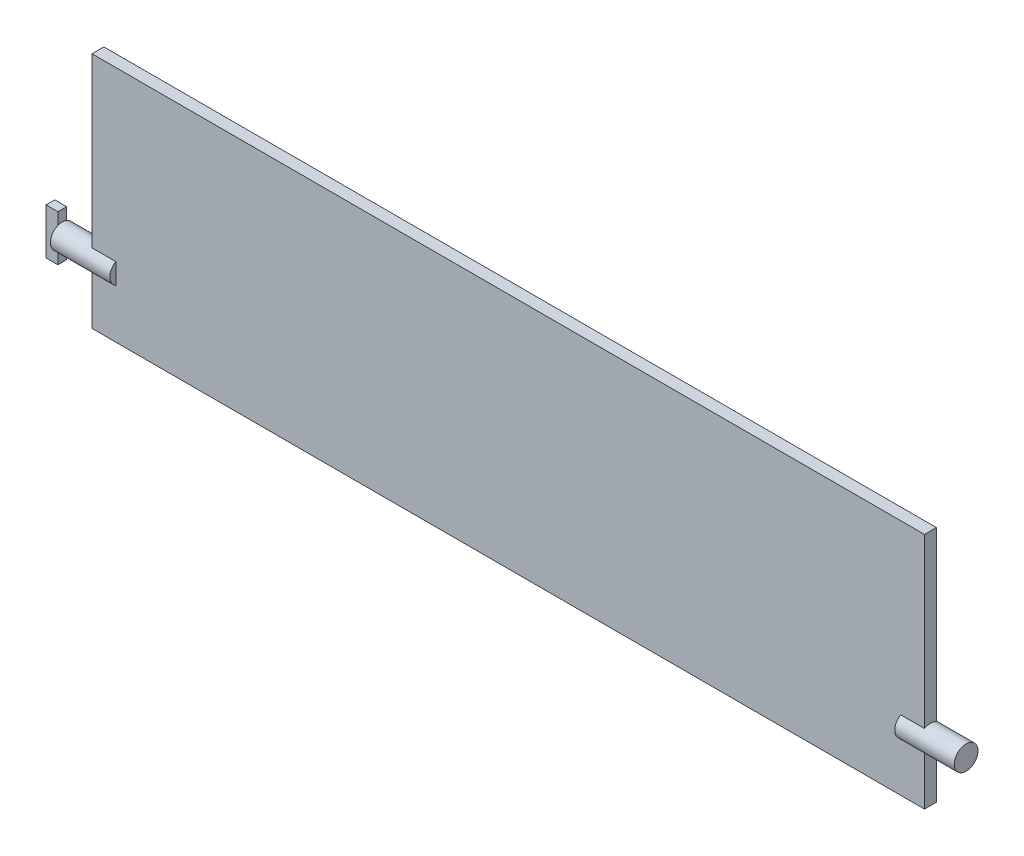
ISO-10303-21;
HEADER;
FILE_DESCRIPTION(('STEP AP214'),'2;1');
FILE_NAME('part.step','',(''),(''),'','','');
FILE_SCHEMA(('AUTOMOTIVE_DESIGN { 1 0 10303 214 1 1 1 1 }'));
ENDSEC;
DATA;
#1=APPLICATION_CONTEXT('core data for automotive mechanical design processes');
#2=APPLICATION_PROTOCOL_DEFINITION('international standard','automotive_design',2000,#1);
#3=PRODUCT_CONTEXT('',#1,'mechanical');
#4=PRODUCT('Part','Part','',(#3));
#5=PRODUCT_RELATED_PRODUCT_CATEGORY('part','',(#4));
#6=PRODUCT_DEFINITION_FORMATION('','',#4);
#7=PRODUCT_DEFINITION_CONTEXT('part definition',#1,'design');
#8=PRODUCT_DEFINITION('design','',#6,#7);
#9=PRODUCT_DEFINITION_SHAPE('','',#8);
#10=(LENGTH_UNIT() NAMED_UNIT(*) SI_UNIT(.MILLI.,.METRE.));
#11=(NAMED_UNIT(*) PLANE_ANGLE_UNIT() SI_UNIT($,.RADIAN.));
#12=(NAMED_UNIT(*) SI_UNIT($,.STERADIAN.) SOLID_ANGLE_UNIT());
#13=UNCERTAINTY_MEASURE_WITH_UNIT(LENGTH_MEASURE(1.E-05),#10,'distance_accuracy_value','');
#14=(GEOMETRIC_REPRESENTATION_CONTEXT(3) GLOBAL_UNCERTAINTY_ASSIGNED_CONTEXT((#13)) GLOBAL_UNIT_ASSIGNED_CONTEXT((#10,
#11,#12)) REPRESENTATION_CONTEXT('',''));
#15=CARTESIAN_POINT('',(0.,0.,0.));
#16=DIRECTION('',(0.,0.,1.));
#17=DIRECTION('',(1.,0.,0.));
#18=AXIS2_PLACEMENT_3D('',#15,#16,#17);
#19=CARTESIAN_POINT('',(-190.,0.,2.5));
#20=DIRECTION('',(-1.,0.,0.));
#21=DIRECTION('',(0.,0.,1.));
#22=AXIS2_PLACEMENT_3D('',#19,#20,#21);
#23=PLANE('',#22);
#24=DIRECTION('',(0.,1.,0.));
#25=VECTOR('',#24,1.);
#26=CARTESIAN_POINT('',(-190.,9.65589929881177,4.33441883065827));
#27=LINE('',#26,#25);
#28=CARTESIAN_POINT('',(-190.,-4.651333954225,4.33441883065827));
#29=VERTEX_POINT('',#28);
#30=CARTESIAN_POINT('',(-190.,4.651333954225,4.33441883065827));
#31=VERTEX_POINT('',#30);
#32=EDGE_CURVE('E11',#29,#31,#27,.T.);
#33=ORIENTED_EDGE('',*,*,#32,.F.);
#34=CARTESIAN_POINT('',(-190.,0.,2.5));
#35=DIRECTION('',(-1.,0.,0.));
#36=DIRECTION('',(0.,0.,1.));
#37=AXIS2_PLACEMENT_3D('',#34,#35,#36);
#38=CIRCLE('',#37,5.);
#39=EDGE_CURVE('E219',#29,#31,#38,.T.);
#40=ORIENTED_EDGE('',*,*,#39,.T.);
#41=EDGE_LOOP('',(#33,#40));
#42=FACE_BOUND('',#41,.T.);
#43=ADVANCED_FACE('F35',(#42),#23,.T.);
#44=CARTESIAN_POINT('',(175.,-25.,5.));
#45=DIRECTION('',(-1.,0.,0.));
#46=DIRECTION('',(0.,0.,1.));
#47=AXIS2_PLACEMENT_3D('',#44,#45,#46);
#48=PLANE('',#47);
#49=CARTESIAN_POINT('',(175.,0.,2.5));
#50=DIRECTION('',(-1.,0.,0.));
#51=DIRECTION('',(0.,0.,1.));
#52=AXIS2_PLACEMENT_3D('',#49,#50,#51);
#53=CIRCLE('',#52,5.);
#54=CARTESIAN_POINT('',(175.,-4.33012701892219,5.));
#55=VERTEX_POINT('',#54);
#56=CARTESIAN_POINT('',(175.,-4.33012701892219,0.));
#57=VERTEX_POINT('',#56);
#58=EDGE_CURVE('E212',#55,#57,#53,.F.);
#59=ORIENTED_EDGE('',*,*,#58,.F.);
#60=DIRECTION('',(0.,1.,0.));
#61=VECTOR('',#60,1.);
#62=CARTESIAN_POINT('',(175.,-25.,5.));
#63=LINE('',#62,#61);
#64=CARTESIAN_POINT('',(175.,-25.,5.));
#65=VERTEX_POINT('',#64);
#66=EDGE_CURVE('E241',#65,#55,#63,.T.);
#67=ORIENTED_EDGE('',*,*,#66,.F.);
#68=DIRECTION('',(0.,0.,-1.));
#69=VECTOR('',#68,1.);
#70=CARTESIAN_POINT('',(175.,-25.,5.));
#71=LINE('',#70,#69);
#72=CARTESIAN_POINT('',(175.,-25.,0.));
#73=VERTEX_POINT('',#72);
#74=EDGE_CURVE('E251',#65,#73,#71,.T.);
#75=ORIENTED_EDGE('',*,*,#74,.T.);
#76=DIRECTION('',(0.,1.,0.));
#77=VECTOR('',#76,1.);
#78=CARTESIAN_POINT('',(175.,-25.,0.));
#79=LINE('',#78,#77);
#80=EDGE_CURVE('E252',#73,#57,#79,.T.);
#81=ORIENTED_EDGE('',*,*,#80,.T.);
#82=EDGE_LOOP('',(#59,#67,#75,#81));
#83=FACE_BOUND('',#82,.T.);
#84=ADVANCED_FACE('F328',(#83),#48,.F.);
#85=CARTESIAN_POINT('',(0.,0.,5.));
#86=DIRECTION('',(0.,0.,-1.));
#87=DIRECTION('',(-1.,0.,0.));
#88=AXIS2_PLACEMENT_3D('',#85,#86,#87);
#89=PLANE('',#88);
#90=DIRECTION('',(1.,0.,0.));
#91=VECTOR('',#90,1.);
#92=CARTESIAN_POINT('',(165.,4.33012701892219,5.));
#93=LINE('',#92,#91);
#94=CARTESIAN_POINT('',(175.,4.33012701892219,5.));
#95=VERTEX_POINT('',#94);
#96=CARTESIAN_POINT('',(165.,4.33012701892219,5.));
#97=VERTEX_POINT('',#96);
#98=EDGE_CURVE('E217',#95,#97,#93,.F.);
#99=ORIENTED_EDGE('',*,*,#98,.F.);
#100=CARTESIAN_POINT('',(175.,75.,5.));
#101=VERTEX_POINT('',#100);
#102=EDGE_CURVE('E245',#95,#101,#63,.T.);
#103=ORIENTED_EDGE('',*,*,#102,.T.);
#104=DIRECTION('',(1.,0.,0.));
#105=VECTOR('',#104,1.);
#106=CARTESIAN_POINT('',(-175.,75.,5.));
#107=LINE('',#106,#105);
#108=CARTESIAN_POINT('',(-175.,75.,5.));
#109=VERTEX_POINT('',#108);
#110=EDGE_CURVE('E197',#109,#101,#107,.T.);
#111=ORIENTED_EDGE('',*,*,#110,.F.);
#112=DIRECTION('',(0.,-1.,0.));
#113=VECTOR('',#112,1.);
#114=CARTESIAN_POINT('',(-175.,-25.,5.));
#115=LINE('',#114,#113);
#116=CARTESIAN_POINT('',(-175.,4.33012701892219,5.));
#117=VERTEX_POINT('',#116);
#118=EDGE_CURVE('E246',#109,#117,#115,.T.);
#119=ORIENTED_EDGE('',*,*,#118,.T.);
#120=DIRECTION('',(-1.,0.,0.));
#121=VECTOR('',#120,1.);
#122=CARTESIAN_POINT('',(-165.,4.33012701892219,5.));
#123=LINE('',#122,#121);
#124=CARTESIAN_POINT('',(-165.,4.33012701892219,5.));
#125=VERTEX_POINT('',#124);
#126=EDGE_CURVE('E233',#117,#125,#123,.F.);
#127=ORIENTED_EDGE('',*,*,#126,.T.);
#128=DIRECTION('',(0.,1.,0.));
#129=VECTOR('',#128,1.);
#130=CARTESIAN_POINT('',(-165.,0.,5.));
#131=LINE('',#130,#129);
#132=CARTESIAN_POINT('',(-165.,-4.33012701892219,5.));
#133=VERTEX_POINT('',#132);
#134=EDGE_CURVE('E228',#133,#125,#131,.T.);
#135=ORIENTED_EDGE('',*,*,#134,.F.);
#136=DIRECTION('',(-1.,0.,0.));
#137=VECTOR('',#136,1.);
#138=CARTESIAN_POINT('',(-165.,-4.33012701892219,5.));
#139=LINE('',#138,#137);
#140=CARTESIAN_POINT('',(-175.,-4.33012701892219,5.));
#141=VERTEX_POINT('',#140);
#142=EDGE_CURVE('E237',#133,#141,#139,.T.);
#143=ORIENTED_EDGE('',*,*,#142,.T.);
#144=CARTESIAN_POINT('',(-175.,-25.,5.));
#145=VERTEX_POINT('',#144);
#146=EDGE_CURVE('E244',#141,#145,#115,.T.);
#147=ORIENTED_EDGE('',*,*,#146,.T.);
#148=DIRECTION('',(1.,0.,0.));
#149=VECTOR('',#148,1.);
#150=CARTESIAN_POINT('',(-175.,-25.,5.));
#151=LINE('',#150,#149);
#152=EDGE_CURVE('E249',#145,#65,#151,.T.);
#153=ORIENTED_EDGE('',*,*,#152,.T.);
#154=ORIENTED_EDGE('',*,*,#66,.T.);
#155=DIRECTION('',(1.,0.,0.));
#156=VECTOR('',#155,1.);
#157=CARTESIAN_POINT('',(165.,-4.33012701892219,5.));
#158=LINE('',#157,#156);
#159=CARTESIAN_POINT('',(165.,-4.33012701892219,5.));
#160=VERTEX_POINT('',#159);
#161=EDGE_CURVE('E214',#160,#55,#158,.T.);
#162=ORIENTED_EDGE('',*,*,#161,.F.);
#163=DIRECTION('',(0.,-1.,0.));
#164=VECTOR('',#163,1.);
#165=CARTESIAN_POINT('',(165.,0.,5.));
#166=LINE('',#165,#164);
#167=EDGE_CURVE('E210',#97,#160,#166,.T.);
#168=ORIENTED_EDGE('',*,*,#167,.F.);
#169=EDGE_LOOP('',(#99,#103,#111,#119,#127,#135,#143,#147,#153,#154,#162,#168));
#170=FACE_BOUND('',#169,.T.);
#171=ADVANCED_FACE('F334',(#170),#89,.F.);
#172=CARTESIAN_POINT('',(0.,0.,0.));
#173=DIRECTION('',(0.,0.,-1.));
#174=DIRECTION('',(-1.,0.,0.));
#175=AXIS2_PLACEMENT_3D('',#172,#173,#174);
#176=PLANE('',#175);
#177=CARTESIAN_POINT('',(175.,4.33012701892219,0.));
#178=VERTEX_POINT('',#177);
#179=CARTESIAN_POINT('',(175.,75.,0.));
#180=VERTEX_POINT('',#179);
#181=EDGE_CURVE('E240',#178,#180,#79,.T.);
#182=ORIENTED_EDGE('',*,*,#181,.F.);
#183=DIRECTION('',(1.,0.,0.));
#184=VECTOR('',#183,1.);
#185=CARTESIAN_POINT('',(165.,4.33012701892219,0.));
#186=LINE('',#185,#184);
#187=CARTESIAN_POINT('',(165.,4.33012701892219,0.));
#188=VERTEX_POINT('',#187);
#189=EDGE_CURVE('E39',#178,#188,#186,.F.);
#190=ORIENTED_EDGE('',*,*,#189,.T.);
#191=DIRECTION('',(0.,-1.,0.));
#192=VECTOR('',#191,1.);
#193=CARTESIAN_POINT('',(165.,0.,0.));
#194=LINE('',#193,#192);
#195=CARTESIAN_POINT('',(165.,-4.33012701892219,0.));
#196=VERTEX_POINT('',#195);
#197=EDGE_CURVE('E274',#188,#196,#194,.T.);
#198=ORIENTED_EDGE('',*,*,#197,.T.);
#199=DIRECTION('',(1.,0.,0.));
#200=VECTOR('',#199,1.);
#201=CARTESIAN_POINT('',(165.,-4.33012701892219,0.));
#202=LINE('',#201,#200);
#203=EDGE_CURVE('E276',#196,#57,#202,.T.);
#204=ORIENTED_EDGE('',*,*,#203,.T.);
#205=ORIENTED_EDGE('',*,*,#80,.F.);
#206=DIRECTION('',(1.,0.,0.));
#207=VECTOR('',#206,1.);
#208=CARTESIAN_POINT('',(-175.,-25.,0.));
#209=LINE('',#208,#207);
#210=CARTESIAN_POINT('',(-175.,-25.,0.));
#211=VERTEX_POINT('',#210);
#212=EDGE_CURVE('E259',#211,#73,#209,.T.);
#213=ORIENTED_EDGE('',*,*,#212,.F.);
#214=DIRECTION('',(0.,-1.,0.));
#215=VECTOR('',#214,1.);
#216=CARTESIAN_POINT('',(-175.,-25.,0.));
#217=LINE('',#216,#215);
#218=CARTESIAN_POINT('',(-175.,-4.33012701892219,0.));
#219=VERTEX_POINT('',#218);
#220=EDGE_CURVE('E255',#219,#211,#217,.T.);
#221=ORIENTED_EDGE('',*,*,#220,.F.);
#222=DIRECTION('',(-1.,0.,0.));
#223=VECTOR('',#222,1.);
#224=CARTESIAN_POINT('',(-165.,-4.33012701892219,0.));
#225=LINE('',#224,#223);
#226=CARTESIAN_POINT('',(-165.,-4.33012701892219,0.));
#227=VERTEX_POINT('',#226);
#228=EDGE_CURVE('E272',#227,#219,#225,.T.);
#229=ORIENTED_EDGE('',*,*,#228,.F.);
#230=DIRECTION('',(0.,1.,0.));
#231=VECTOR('',#230,1.);
#232=CARTESIAN_POINT('',(-165.,0.,0.));
#233=LINE('',#232,#231);
#234=CARTESIAN_POINT('',(-165.,4.33012701892219,0.));
#235=VERTEX_POINT('',#234);
#236=EDGE_CURVE('E266',#227,#235,#233,.T.);
#237=ORIENTED_EDGE('',*,*,#236,.T.);
#238=DIRECTION('',(-1.,0.,0.));
#239=VECTOR('',#238,1.);
#240=CARTESIAN_POINT('',(-165.,4.33012701892219,0.));
#241=LINE('',#240,#239);
#242=CARTESIAN_POINT('',(-175.,4.33012701892219,0.));
#243=VERTEX_POINT('',#242);
#244=EDGE_CURVE('E269',#243,#235,#241,.F.);
#245=ORIENTED_EDGE('',*,*,#244,.F.);
#246=CARTESIAN_POINT('',(-175.,75.,0.));
#247=VERTEX_POINT('',#246);
#248=EDGE_CURVE('E256',#247,#243,#217,.T.);
#249=ORIENTED_EDGE('',*,*,#248,.F.);
#250=DIRECTION('',(-1.,0.,0.));
#251=VECTOR('',#250,1.);
#252=CARTESIAN_POINT('',(175.,75.,0.));
#253=LINE('',#252,#251);
#254=EDGE_CURVE('E186',#180,#247,#253,.T.);
#255=ORIENTED_EDGE('',*,*,#254,.F.);
#256=EDGE_LOOP('',(#182,#190,#198,#204,#205,#213,#221,#229,#237,#245,#249,#255));
#257=FACE_BOUND('',#256,.T.);
#258=ADVANCED_FACE('F359',(#257),#176,.T.);
#259=CARTESIAN_POINT('',(-175.,-25.,5.));
#260=DIRECTION('',(1.,0.,0.));
#261=DIRECTION('',(0.,0.,-1.));
#262=AXIS2_PLACEMENT_3D('',#259,#260,#261);
#263=PLANE('',#262);
#264=ORIENTED_EDGE('',*,*,#248,.T.);
#265=CARTESIAN_POINT('',(-175.,0.,2.5));
#266=DIRECTION('',(1.,0.,0.));
#267=DIRECTION('',(0.,0.,-1.));
#268=AXIS2_PLACEMENT_3D('',#265,#266,#267);
#269=CIRCLE('',#268,5.);
#270=EDGE_CURVE('E230',#243,#117,#269,.T.);
#271=ORIENTED_EDGE('',*,*,#270,.T.);
#272=ORIENTED_EDGE('',*,*,#118,.F.);
#273=DIRECTION('',(0.,0.,1.));
#274=VECTOR('',#273,1.);
#275=CARTESIAN_POINT('',(-175.,75.,0.));
#276=LINE('',#275,#274);
#277=EDGE_CURVE('E189',#247,#109,#276,.T.);
#278=ORIENTED_EDGE('',*,*,#277,.F.);
#279=EDGE_LOOP('',(#264,#271,#272,#278));
#280=FACE_BOUND('',#279,.T.);
#281=ADVANCED_FACE('F363',(#280),#263,.F.);
#282=EDGE_CURVE('E215',#178,#95,#53,.F.);
#283=ORIENTED_EDGE('',*,*,#282,.F.);
#284=ORIENTED_EDGE('',*,*,#181,.T.);
#285=DIRECTION('',(0.,0.,-1.));
#286=VECTOR('',#285,1.);
#287=CARTESIAN_POINT('',(175.,75.,5.));
#288=LINE('',#287,#286);
#289=EDGE_CURVE('E200',#101,#180,#288,.T.);
#290=ORIENTED_EDGE('',*,*,#289,.F.);
#291=ORIENTED_EDGE('',*,*,#102,.F.);
#292=EDGE_LOOP('',(#283,#284,#290,#291));
#293=FACE_BOUND('',#292,.T.);
#294=ADVANCED_FACE('F37',(#293),#48,.F.);
#295=ORIENTED_EDGE('',*,*,#146,.F.);
#296=EDGE_CURVE('E234',#141,#219,#269,.T.);
#297=ORIENTED_EDGE('',*,*,#296,.T.);
#298=ORIENTED_EDGE('',*,*,#220,.T.);
#299=DIRECTION('',(0.,0.,-1.));
#300=VECTOR('',#299,1.);
#301=CARTESIAN_POINT('',(-175.,-25.,5.));
#302=LINE('',#301,#300);
#303=EDGE_CURVE('E263',#145,#211,#302,.T.);
#304=ORIENTED_EDGE('',*,*,#303,.F.);
#305=EDGE_LOOP('',(#295,#297,#298,#304));
#306=FACE_BOUND('',#305,.T.);
#307=ADVANCED_FACE('F365',(#306),#263,.F.);
#308=CARTESIAN_POINT('',(-175.,-25.,5.));
#309=DIRECTION('',(0.,1.,0.));
#310=DIRECTION('',(0.,0.,1.));
#311=AXIS2_PLACEMENT_3D('',#308,#309,#310);
#312=PLANE('',#311);
#313=ORIENTED_EDGE('',*,*,#212,.T.);
#314=ORIENTED_EDGE('',*,*,#74,.F.);
#315=ORIENTED_EDGE('',*,*,#152,.F.);
#316=ORIENTED_EDGE('',*,*,#303,.T.);
#317=EDGE_LOOP('',(#313,#314,#315,#316));
#318=FACE_BOUND('',#317,.T.);
#319=ADVANCED_FACE('F356',(#318),#312,.F.);
#320=CARTESIAN_POINT('',(-165.,0.,2.5));
#321=DIRECTION('',(-1.,0.,0.));
#322=DIRECTION('',(0.,0.,1.));
#323=AXIS2_PLACEMENT_3D('',#320,#321,#322);
#324=CYLINDRICAL_SURFACE('',#323,5.);
#325=CARTESIAN_POINT('',(-190.,4.651333954225,0.665581169341731));
#326=VERTEX_POINT('',#325);
#327=EDGE_CURVE('E220',#31,#326,#38,.T.);
#328=ORIENTED_EDGE('',*,*,#327,.F.);
#329=ORIENTED_EDGE('',*,*,#39,.F.);
#330=CARTESIAN_POINT('',(-190.,-4.651333954225,0.665581169341731));
#331=VERTEX_POINT('',#330);
#332=EDGE_CURVE('E307',#331,#29,#38,.T.);
#333=ORIENTED_EDGE('',*,*,#332,.F.);
#334=EDGE_CURVE('E224',#326,#331,#38,.T.);
#335=ORIENTED_EDGE('',*,*,#334,.F.);
#336=EDGE_LOOP('',(#328,#329,#333,#335));
#337=FACE_BOUND('',#336,.T.);
#338=ORIENTED_EDGE('',*,*,#142,.F.);
#339=CARTESIAN_POINT('',(-165.,0.,2.5));
#340=DIRECTION('',(-1.,0.,0.));
#341=DIRECTION('',(0.,0.,1.));
#342=AXIS2_PLACEMENT_3D('',#339,#340,#341);
#343=CIRCLE('',#342,5.);
#344=EDGE_CURVE('E223',#133,#125,#343,.T.);
#345=ORIENTED_EDGE('',*,*,#344,.T.);
#346=ORIENTED_EDGE('',*,*,#126,.F.);
#347=ORIENTED_EDGE('',*,*,#270,.F.);
#348=ORIENTED_EDGE('',*,*,#244,.T.);
#349=EDGE_CURVE('E227',#235,#227,#343,.T.);
#350=ORIENTED_EDGE('',*,*,#349,.T.);
#351=ORIENTED_EDGE('',*,*,#228,.T.);
#352=ORIENTED_EDGE('',*,*,#296,.F.);
#353=EDGE_LOOP('',(#338,#345,#346,#347,#348,#350,#351,#352));
#354=FACE_BOUND('',#353,.T.);
#355=ADVANCED_FACE('F310',(#337,#354),#324,.T.);
#356=CARTESIAN_POINT('',(-165.,0.,2.5));
#357=DIRECTION('',(-1.,0.,0.));
#358=DIRECTION('',(0.,0.,1.));
#359=AXIS2_PLACEMENT_3D('',#356,#357,#358);
#360=PLANE('',#359);
#361=ORIENTED_EDGE('',*,*,#344,.F.);
#362=ORIENTED_EDGE('',*,*,#134,.T.);
#363=EDGE_LOOP('',(#361,#362));
#364=FACE_BOUND('',#363,.T.);
#365=ADVANCED_FACE('F347',(#364),#360,.F.);
#366=ORIENTED_EDGE('',*,*,#236,.F.);
#367=ORIENTED_EDGE('',*,*,#349,.F.);
#368=EDGE_LOOP('',(#366,#367));
#369=FACE_BOUND('',#368,.T.);
#370=ADVANCED_FACE('F340',(#369),#360,.F.);
#371=DIRECTION('',(0.,-1.,0.));
#372=VECTOR('',#371,1.);
#373=CARTESIAN_POINT('',(-190.,9.65589929881177,0.665581169341731));
#374=LINE('',#373,#372);
#375=EDGE_CURVE('E44',#326,#331,#374,.T.);
#376=ORIENTED_EDGE('',*,*,#375,.F.);
#377=ORIENTED_EDGE('',*,*,#334,.T.);
#378=EDGE_LOOP('',(#376,#377));
#379=FACE_BOUND('',#378,.T.);
#380=ADVANCED_FACE('F330',(#379),#23,.T.);
#381=CARTESIAN_POINT('',(165.,0.,2.5));
#382=DIRECTION('',(1.,0.,0.));
#383=DIRECTION('',(0.,0.,-1.));
#384=AXIS2_PLACEMENT_3D('',#381,#382,#383);
#385=CYLINDRICAL_SURFACE('',#384,5.);
#386=CARTESIAN_POINT('',(190.,0.,2.5));
#387=DIRECTION('',(-1.,0.,0.));
#388=DIRECTION('',(0.,0.,1.));
#389=AXIS2_PLACEMENT_3D('',#386,#387,#388);
#390=CIRCLE('',#389,5.);
#391=CARTESIAN_POINT('',(190.,0.,7.5));
#392=VERTEX_POINT('',#391);
#393=EDGE_CURVE('E203',#392,#392,#390,.T.);
#394=ORIENTED_EDGE('',*,*,#393,.T.);
#395=EDGE_LOOP('',(#394));
#396=FACE_BOUND('',#395,.T.);
#397=ORIENTED_EDGE('',*,*,#282,.T.);
#398=ORIENTED_EDGE('',*,*,#98,.T.);
#399=CARTESIAN_POINT('',(165.,0.,2.5));
#400=DIRECTION('',(-1.,0.,0.));
#401=DIRECTION('',(0.,0.,1.));
#402=AXIS2_PLACEMENT_3D('',#399,#400,#401);
#403=CIRCLE('',#402,5.);
#404=EDGE_CURVE('E206',#160,#97,#403,.T.);
#405=ORIENTED_EDGE('',*,*,#404,.F.);
#406=ORIENTED_EDGE('',*,*,#161,.T.);
#407=ORIENTED_EDGE('',*,*,#58,.T.);
#408=ORIENTED_EDGE('',*,*,#203,.F.);
#409=EDGE_CURVE('E209',#188,#196,#403,.T.);
#410=ORIENTED_EDGE('',*,*,#409,.F.);
#411=ORIENTED_EDGE('',*,*,#189,.F.);
#412=EDGE_LOOP('',(#397,#398,#405,#406,#407,#408,#410,#411));
#413=FACE_BOUND('',#412,.T.);
#414=ADVANCED_FACE('F339',(#396,#413),#385,.T.);
#415=CARTESIAN_POINT('',(165.,0.,2.5));
#416=DIRECTION('',(1.,0.,0.));
#417=DIRECTION('',(0.,0.,1.));
#418=AXIS2_PLACEMENT_3D('',#415,#416,#417);
#419=PLANE('',#418);
#420=ORIENTED_EDGE('',*,*,#404,.T.);
#421=ORIENTED_EDGE('',*,*,#167,.T.);
#422=EDGE_LOOP('',(#420,#421));
#423=FACE_BOUND('',#422,.T.);
#424=ADVANCED_FACE('F345',(#423),#419,.F.);
#425=ORIENTED_EDGE('',*,*,#197,.F.);
#426=ORIENTED_EDGE('',*,*,#409,.T.);
#427=EDGE_LOOP('',(#425,#426));
#428=FACE_BOUND('',#427,.T.);
#429=ADVANCED_FACE('F405',(#428),#419,.F.);
#430=CARTESIAN_POINT('',(190.,0.,2.5));
#431=DIRECTION('',(1.,0.,0.));
#432=DIRECTION('',(0.,0.,1.));
#433=AXIS2_PLACEMENT_3D('',#430,#431,#432);
#434=PLANE('',#433);
#435=ORIENTED_EDGE('',*,*,#393,.F.);
#436=EDGE_LOOP('',(#435));
#437=FACE_BOUND('',#436,.T.);
#438=ADVANCED_FACE('F322',(#437),#434,.T.);
#439=CARTESIAN_POINT('',(0.,75.,0.));
#440=DIRECTION('',(0.,1.,0.));
#441=DIRECTION('',(0.,0.,1.));
#442=AXIS2_PLACEMENT_3D('',#439,#440,#441);
#443=PLANE('',#442);
#444=ORIENTED_EDGE('',*,*,#254,.T.);
#445=ORIENTED_EDGE('',*,*,#277,.T.);
#446=ORIENTED_EDGE('',*,*,#110,.T.);
#447=ORIENTED_EDGE('',*,*,#289,.T.);
#448=EDGE_LOOP('',(#444,#445,#446,#447));
#449=FACE_BOUND('',#448,.T.);
#450=ADVANCED_FACE('F316',(#449),#443,.T.);
#451=CARTESIAN_POINT('',(-190.,0.,0.));
#452=DIRECTION('',(-1.,0.,0.));
#453=DIRECTION('',(0.,0.,1.));
#454=AXIS2_PLACEMENT_3D('',#451,#452,#453);
#455=PLANE('',#454);
#456=CARTESIAN_POINT('',(-190.,9.65589929881177,4.33441883065827));
#457=VERTEX_POINT('',#456);
#458=EDGE_CURVE('E47',#31,#457,#27,.T.);
#459=ORIENTED_EDGE('',*,*,#458,.F.);
#460=ORIENTED_EDGE('',*,*,#327,.T.);
#461=CARTESIAN_POINT('',(-190.,9.65589929881177,0.665581169341731));
#462=VERTEX_POINT('',#461);
#463=EDGE_CURVE('E284',#462,#326,#374,.T.);
#464=ORIENTED_EDGE('',*,*,#463,.F.);
#465=DIRECTION('',(0.,0.,-1.));
#466=VECTOR('',#465,1.);
#467=CARTESIAN_POINT('',(-190.,9.65589929881177,0.665581169341731));
#468=LINE('',#467,#466);
#469=EDGE_CURVE('E290',#457,#462,#468,.T.);
#470=ORIENTED_EDGE('',*,*,#469,.F.);
#471=EDGE_LOOP('',(#459,#460,#464,#470));
#472=FACE_BOUND('',#471,.T.);
#473=ADVANCED_FACE('F314',(#472),#455,.F.);
#474=CARTESIAN_POINT('',(-190.,-9.65589929881177,0.665581169341731));
#475=VERTEX_POINT('',#474);
#476=EDGE_CURVE('E285',#331,#475,#374,.T.);
#477=ORIENTED_EDGE('',*,*,#476,.F.);
#478=ORIENTED_EDGE('',*,*,#332,.T.);
#479=CARTESIAN_POINT('',(-190.,-9.65589929881177,4.33441883065827));
#480=VERTEX_POINT('',#479);
#481=EDGE_CURVE('E46',#480,#29,#27,.T.);
#482=ORIENTED_EDGE('',*,*,#481,.F.);
#483=DIRECTION('',(0.,0.,1.));
#484=VECTOR('',#483,1.);
#485=CARTESIAN_POINT('',(-190.,-9.65589929881177,0.665581169341731));
#486=LINE('',#485,#484);
#487=EDGE_CURVE('E180',#475,#480,#486,.T.);
#488=ORIENTED_EDGE('',*,*,#487,.F.);
#489=EDGE_LOOP('',(#477,#478,#482,#488));
#490=FACE_BOUND('',#489,.T.);
#491=ADVANCED_FACE('F305',(#490),#455,.F.);
#492=CARTESIAN_POINT('',(-195.,9.65589929881177,4.33441883065827));
#493=DIRECTION('',(0.,0.,-1.));
#494=DIRECTION('',(-1.,0.,0.));
#495=AXIS2_PLACEMENT_3D('',#492,#493,#494);
#496=PLANE('',#495);
#497=ORIENTED_EDGE('',*,*,#481,.T.);
#498=ORIENTED_EDGE('',*,*,#32,.T.);
#499=ORIENTED_EDGE('',*,*,#458,.T.);
#500=DIRECTION('',(1.,0.,0.));
#501=VECTOR('',#500,1.);
#502=CARTESIAN_POINT('',(-195.,9.65589929881177,4.33441883065827));
#503=LINE('',#502,#501);
#504=CARTESIAN_POINT('',(-195.,9.65589929881177,4.33441883065827));
#505=VERTEX_POINT('',#504);
#506=EDGE_CURVE('E165',#505,#457,#503,.T.);
#507=ORIENTED_EDGE('',*,*,#506,.F.);
#508=DIRECTION('',(0.,1.,0.));
#509=VECTOR('',#508,1.);
#510=CARTESIAN_POINT('',(-195.,9.65589929881177,4.33441883065827));
#511=LINE('',#510,#509);
#512=CARTESIAN_POINT('',(-195.,-9.65589929881177,4.33441883065827));
#513=VERTEX_POINT('',#512);
#514=EDGE_CURVE('E171',#513,#505,#511,.T.);
#515=ORIENTED_EDGE('',*,*,#514,.F.);
#516=DIRECTION('',(1.,0.,0.));
#517=VECTOR('',#516,1.);
#518=CARTESIAN_POINT('',(-195.,-9.65589929881177,4.33441883065827));
#519=LINE('',#518,#517);
#520=EDGE_CURVE('E296',#513,#480,#519,.T.);
#521=ORIENTED_EDGE('',*,*,#520,.T.);
#522=EDGE_LOOP('',(#497,#498,#499,#507,#515,#521));
#523=FACE_BOUND('',#522,.T.);
#524=ADVANCED_FACE('F183',(#523),#496,.F.);
#525=CARTESIAN_POINT('',(-195.,9.65589929881177,0.665581169341731));
#526=DIRECTION('',(0.,-1.,0.));
#527=DIRECTION('',(0.,0.,-1.));
#528=AXIS2_PLACEMENT_3D('',#525,#526,#527);
#529=PLANE('',#528);
#530=ORIENTED_EDGE('',*,*,#469,.T.);
#531=DIRECTION('',(1.,0.,0.));
#532=VECTOR('',#531,1.);
#533=CARTESIAN_POINT('',(-195.,9.65589929881177,0.665581169341731));
#534=LINE('',#533,#532);
#535=CARTESIAN_POINT('',(-195.,9.65589929881177,0.665581169341731));
#536=VERTEX_POINT('',#535);
#537=EDGE_CURVE('E167',#536,#462,#534,.T.);
#538=ORIENTED_EDGE('',*,*,#537,.F.);
#539=DIRECTION('',(0.,0.,-1.));
#540=VECTOR('',#539,1.);
#541=CARTESIAN_POINT('',(-195.,9.65589929881177,0.665581169341731));
#542=LINE('',#541,#540);
#543=EDGE_CURVE('E161',#505,#536,#542,.T.);
#544=ORIENTED_EDGE('',*,*,#543,.F.);
#545=ORIENTED_EDGE('',*,*,#506,.T.);
#546=EDGE_LOOP('',(#530,#538,#544,#545));
#547=FACE_BOUND('',#546,.T.);
#548=ADVANCED_FACE('F163',(#547),#529,.F.);
#549=CARTESIAN_POINT('',(-195.,9.65589929881177,0.665581169341731));
#550=DIRECTION('',(0.,0.,1.));
#551=DIRECTION('',(1.,0.,0.));
#552=AXIS2_PLACEMENT_3D('',#549,#550,#551);
#553=PLANE('',#552);
#554=ORIENTED_EDGE('',*,*,#463,.T.);
#555=ORIENTED_EDGE('',*,*,#375,.T.);
#556=ORIENTED_EDGE('',*,*,#476,.T.);
#557=DIRECTION('',(1.,0.,0.));
#558=VECTOR('',#557,1.);
#559=CARTESIAN_POINT('',(-195.,-9.65589929881177,0.665581169341731));
#560=LINE('',#559,#558);
#561=CARTESIAN_POINT('',(-195.,-9.65589929881177,0.665581169341731));
#562=VERTEX_POINT('',#561);
#563=EDGE_CURVE('E191',#562,#475,#560,.T.);
#564=ORIENTED_EDGE('',*,*,#563,.F.);
#565=DIRECTION('',(0.,-1.,0.));
#566=VECTOR('',#565,1.);
#567=CARTESIAN_POINT('',(-195.,9.65589929881177,0.665581169341731));
#568=LINE('',#567,#566);
#569=EDGE_CURVE('E170',#536,#562,#568,.T.);
#570=ORIENTED_EDGE('',*,*,#569,.F.);
#571=ORIENTED_EDGE('',*,*,#537,.T.);
#572=EDGE_LOOP('',(#554,#555,#556,#564,#570,#571));
#573=FACE_BOUND('',#572,.T.);
#574=ADVANCED_FACE('F297',(#573),#553,.F.);
#575=CARTESIAN_POINT('',(-195.,-9.65589929881177,0.665581169341731));
#576=DIRECTION('',(0.,1.,0.));
#577=DIRECTION('',(0.,0.,1.));
#578=AXIS2_PLACEMENT_3D('',#575,#576,#577);
#579=PLANE('',#578);
#580=ORIENTED_EDGE('',*,*,#487,.T.);
#581=ORIENTED_EDGE('',*,*,#520,.F.);
#582=DIRECTION('',(0.,0.,1.));
#583=VECTOR('',#582,1.);
#584=CARTESIAN_POINT('',(-195.,-9.65589929881177,0.665581169341731));
#585=LINE('',#584,#583);
#586=EDGE_CURVE('E176',#562,#513,#585,.T.);
#587=ORIENTED_EDGE('',*,*,#586,.F.);
#588=ORIENTED_EDGE('',*,*,#563,.T.);
#589=EDGE_LOOP('',(#580,#581,#587,#588));
#590=FACE_BOUND('',#589,.T.);
#591=ADVANCED_FACE('F300',(#590),#579,.F.);
#592=CARTESIAN_POINT('',(-195.,0.,0.));
#593=DIRECTION('',(-1.,0.,0.));
#594=DIRECTION('',(0.,0.,1.));
#595=AXIS2_PLACEMENT_3D('',#592,#593,#594);
#596=PLANE('',#595);
#597=ORIENTED_EDGE('',*,*,#514,.T.);
#598=ORIENTED_EDGE('',*,*,#543,.T.);
#599=ORIENTED_EDGE('',*,*,#569,.T.);
#600=ORIENTED_EDGE('',*,*,#586,.T.);
#601=EDGE_LOOP('',(#597,#598,#599,#600));
#602=FACE_BOUND('',#601,.T.);
#603=ADVANCED_FACE('F174',(#602),#596,.T.);
#604=CLOSED_SHELL('',(#43,#84,#171,#258,#281,#294,#307,#319,#355,#365,#370,#380,#414,#424,#429,
#438,#450,#473,#491,#524,#548,#574,#591,#603));
#605=MANIFOLD_SOLID_BREP('B2',#604);
#606=ADVANCED_BREP_SHAPE_REPRESENTATION('',(#18,#605),#14);
#607=SHAPE_DEFINITION_REPRESENTATION(#9,#606);
ENDSEC;
END-ISO-10303-21;
